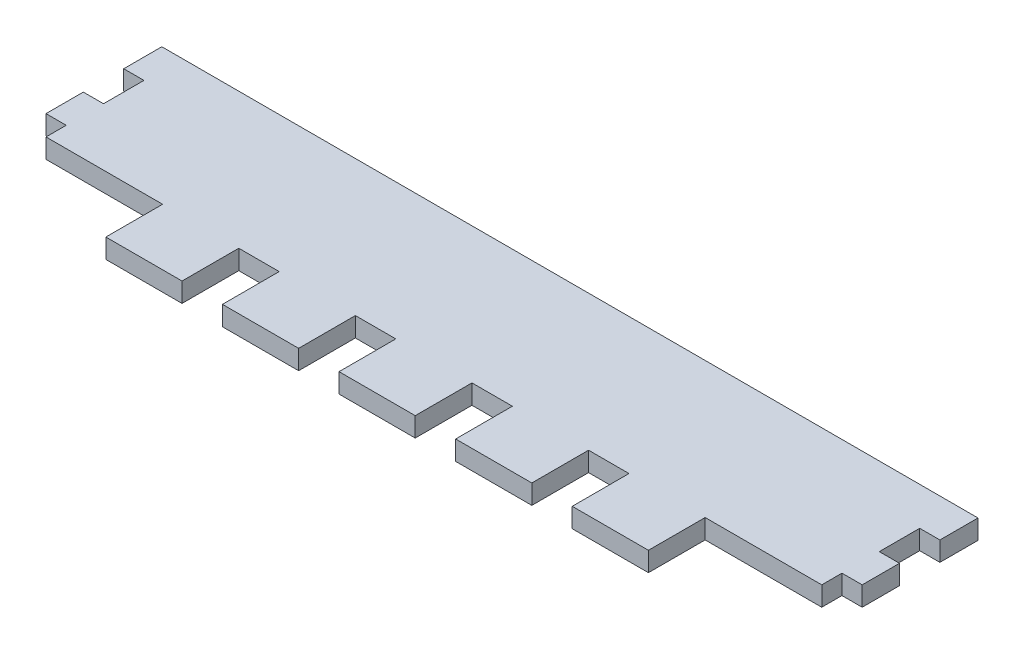
ISO-10303-21;
HEADER;
FILE_DESCRIPTION(('STEP AP214'),'2;1');
FILE_NAME('part.step','',(''),(''),'','','');
FILE_SCHEMA(('AUTOMOTIVE_DESIGN { 1 0 10303 214 1 1 1 1 }'));
ENDSEC;
DATA;
#1=APPLICATION_CONTEXT('core data for automotive mechanical design processes');
#2=APPLICATION_PROTOCOL_DEFINITION('international standard','automotive_design',2000,#1);
#3=PRODUCT_CONTEXT('',#1,'mechanical');
#4=PRODUCT('Part','Part','',(#3));
#5=PRODUCT_RELATED_PRODUCT_CATEGORY('part','',(#4));
#6=PRODUCT_DEFINITION_FORMATION('','',#4);
#7=PRODUCT_DEFINITION_CONTEXT('part definition',#1,'design');
#8=PRODUCT_DEFINITION('design','',#6,#7);
#9=PRODUCT_DEFINITION_SHAPE('','',#8);
#10=(LENGTH_UNIT() NAMED_UNIT(*) SI_UNIT(.MILLI.,.METRE.));
#11=(NAMED_UNIT(*) PLANE_ANGLE_UNIT() SI_UNIT($,.RADIAN.));
#12=(NAMED_UNIT(*) SI_UNIT($,.STERADIAN.) SOLID_ANGLE_UNIT());
#13=UNCERTAINTY_MEASURE_WITH_UNIT(LENGTH_MEASURE(1.E-05),#10,'distance_accuracy_value','');
#14=(GEOMETRIC_REPRESENTATION_CONTEXT(3) GLOBAL_UNCERTAINTY_ASSIGNED_CONTEXT((#13)) GLOBAL_UNIT_ASSIGNED_CONTEXT((#10,
#11,#12)) REPRESENTATION_CONTEXT('',''));
#15=CARTESIAN_POINT('',(0.,0.,0.));
#16=DIRECTION('',(0.,0.,1.));
#17=DIRECTION('',(1.,0.,0.));
#18=AXIS2_PLACEMENT_3D('',#15,#16,#17);
#19=CARTESIAN_POINT('',(-133.35,6.35,28.575));
#20=DIRECTION('',(0.,0.,-1.));
#21=DIRECTION('',(-1.,0.,0.));
#22=AXIS2_PLACEMENT_3D('',#19,#20,#21);
#23=PLANE('',#22);
#24=DIRECTION('',(0.,-1.,0.));
#25=VECTOR('',#24,1.);
#26=CARTESIAN_POINT('',(126.746000000001,6.35,28.575));
#27=LINE('',#26,#25);
#28=CARTESIAN_POINT('',(126.746000000001,6.35,28.575));
#29=VERTEX_POINT('',#28);
#30=CARTESIAN_POINT('',(126.746000000001,0.,28.575));
#31=VERTEX_POINT('',#30);
#32=EDGE_CURVE('E391',#29,#31,#27,.T.);
#33=ORIENTED_EDGE('',*,*,#32,.F.);
#34=DIRECTION('',(1.,0.,0.));
#35=VECTOR('',#34,1.);
#36=CARTESIAN_POINT('',(-133.35,6.35,28.575));
#37=LINE('',#36,#35);
#38=CARTESIAN_POINT('',(88.646,6.35,28.575));
#39=VERTEX_POINT('',#38);
#40=EDGE_CURVE('E625',#39,#29,#37,.T.);
#41=ORIENTED_EDGE('',*,*,#40,.F.);
#42=DIRECTION('',(0.,-1.,0.));
#43=VECTOR('',#42,1.);
#44=CARTESIAN_POINT('',(88.646,6.35,28.575));
#45=LINE('',#44,#43);
#46=CARTESIAN_POINT('',(88.646,0.,28.575));
#47=VERTEX_POINT('',#46);
#48=EDGE_CURVE('E426',#39,#47,#45,.T.);
#49=ORIENTED_EDGE('',*,*,#48,.T.);
#50=DIRECTION('',(1.,0.,0.));
#51=VECTOR('',#50,1.);
#52=CARTESIAN_POINT('',(-133.35,0.,28.575));
#53=LINE('',#52,#51);
#54=EDGE_CURVE('E591',#47,#31,#53,.T.);
#55=ORIENTED_EDGE('',*,*,#54,.T.);
#56=EDGE_LOOP('',(#33,#41,#49,#55));
#57=FACE_BOUND('',#56,.T.);
#58=ADVANCED_FACE('F38',(#57),#23,.F.);
#59=DIRECTION('',(0.,1.,0.));
#60=VECTOR('',#59,1.);
#61=CARTESIAN_POINT('',(-126.745999999999,6.35,28.575));
#62=LINE('',#61,#60);
#63=CARTESIAN_POINT('',(-126.745999999999,0.,28.575));
#64=VERTEX_POINT('',#63);
#65=CARTESIAN_POINT('',(-126.745999999999,6.35,28.575));
#66=VERTEX_POINT('',#65);
#67=EDGE_CURVE('E400',#64,#66,#62,.T.);
#68=ORIENTED_EDGE('',*,*,#67,.F.);
#69=CARTESIAN_POINT('',(-88.646,0.,28.575));
#70=VERTEX_POINT('',#69);
#71=EDGE_CURVE('E587',#64,#70,#53,.T.);
#72=ORIENTED_EDGE('',*,*,#71,.T.);
#73=DIRECTION('',(0.,-1.,0.));
#74=VECTOR('',#73,1.);
#75=CARTESIAN_POINT('',(-88.646,6.35,28.575));
#76=LINE('',#75,#74);
#77=CARTESIAN_POINT('',(-88.646,6.35,28.575));
#78=VERTEX_POINT('',#77);
#79=EDGE_CURVE('E282',#78,#70,#76,.T.);
#80=ORIENTED_EDGE('',*,*,#79,.F.);
#81=EDGE_CURVE('E328',#66,#78,#37,.T.);
#82=ORIENTED_EDGE('',*,*,#81,.F.);
#83=EDGE_LOOP('',(#68,#72,#80,#82));
#84=FACE_BOUND('',#83,.T.);
#85=ADVANCED_FACE('F585',(#84),#23,.F.);
#86=CARTESIAN_POINT('',(133.35,6.35,28.575));
#87=DIRECTION('',(-1.,0.,0.));
#88=DIRECTION('',(0.,0.,1.));
#89=AXIS2_PLACEMENT_3D('',#86,#87,#88);
#90=PLANE('',#89);
#91=DIRECTION('',(0.,1.,0.));
#92=VECTOR('',#91,1.);
#93=CARTESIAN_POINT('',(133.35,6.35,-3.42900000000001));
#94=LINE('',#93,#92);
#95=CARTESIAN_POINT('',(133.35,0.,-3.429));
#96=VERTEX_POINT('',#95);
#97=CARTESIAN_POINT('',(133.35,6.35,-3.429));
#98=VERTEX_POINT('',#97);
#99=EDGE_CURVE('E279',#96,#98,#94,.T.);
#100=ORIENTED_EDGE('',*,*,#99,.F.);
#101=DIRECTION('',(0.,0.,-1.));
#102=VECTOR('',#101,1.);
#103=CARTESIAN_POINT('',(133.35,0.,28.575));
#104=LINE('',#103,#102);
#105=CARTESIAN_POINT('',(133.35,0.,-15.875));
#106=VERTEX_POINT('',#105);
#107=EDGE_CURVE('E274',#96,#106,#104,.T.);
#108=ORIENTED_EDGE('',*,*,#107,.T.);
#109=DIRECTION('',(0.,1.,0.));
#110=VECTOR('',#109,1.);
#111=CARTESIAN_POINT('',(133.35,0.,-15.875));
#112=LINE('',#111,#110);
#113=CARTESIAN_POINT('',(133.35,6.35,-15.875));
#114=VERTEX_POINT('',#113);
#115=EDGE_CURVE('E278',#106,#114,#112,.T.);
#116=ORIENTED_EDGE('',*,*,#115,.T.);
#117=DIRECTION('',(0.,0.,-1.));
#118=VECTOR('',#117,1.);
#119=CARTESIAN_POINT('',(133.35,6.35,28.575));
#120=LINE('',#119,#118);
#121=EDGE_CURVE('E325',#98,#114,#120,.T.);
#122=ORIENTED_EDGE('',*,*,#121,.F.);
#123=EDGE_LOOP('',(#100,#108,#116,#122));
#124=FACE_BOUND('',#123,.T.);
#125=ADVANCED_FACE('F40',(#124),#90,.F.);
#126=DIRECTION('',(0.,-1.,0.));
#127=VECTOR('',#126,1.);
#128=CARTESIAN_POINT('',(133.35,6.35,9.779));
#129=LINE('',#128,#127);
#130=CARTESIAN_POINT('',(133.35,6.35,9.779));
#131=VERTEX_POINT('',#130);
#132=CARTESIAN_POINT('',(133.35,0.,9.779));
#133=VERTEX_POINT('',#132);
#134=EDGE_CURVE('E402',#131,#133,#129,.T.);
#135=ORIENTED_EDGE('',*,*,#134,.F.);
#136=CARTESIAN_POINT('',(133.35,6.35,21.971));
#137=VERTEX_POINT('',#136);
#138=EDGE_CURVE('E324',#137,#131,#120,.T.);
#139=ORIENTED_EDGE('',*,*,#138,.F.);
#140=DIRECTION('',(0.,1.,0.));
#141=VECTOR('',#140,1.);
#142=CARTESIAN_POINT('',(133.35,6.35,21.971));
#143=LINE('',#142,#141);
#144=CARTESIAN_POINT('',(133.35,0.,21.971));
#145=VERTEX_POINT('',#144);
#146=EDGE_CURVE('E393',#145,#137,#143,.T.);
#147=ORIENTED_EDGE('',*,*,#146,.F.);
#148=EDGE_CURVE('E281',#145,#133,#104,.T.);
#149=ORIENTED_EDGE('',*,*,#148,.T.);
#150=EDGE_LOOP('',(#135,#139,#147,#149));
#151=FACE_BOUND('',#150,.T.);
#152=ADVANCED_FACE('F655',(#151),#90,.F.);
#153=CARTESIAN_POINT('',(-133.35,6.35,28.575));
#154=DIRECTION('',(1.,0.,0.));
#155=DIRECTION('',(0.,0.,-1.));
#156=AXIS2_PLACEMENT_3D('',#153,#154,#155);
#157=PLANE('',#156);
#158=DIRECTION('',(0.,-1.,0.));
#159=VECTOR('',#158,1.);
#160=CARTESIAN_POINT('',(-133.35,6.35,21.9710000000019));
#161=LINE('',#160,#159);
#162=CARTESIAN_POINT('',(-133.35,6.35,21.9710000000019));
#163=VERTEX_POINT('',#162);
#164=CARTESIAN_POINT('',(-133.35,0.,21.9710000000019));
#165=VERTEX_POINT('',#164);
#166=EDGE_CURVE('E61',#163,#165,#161,.T.);
#167=ORIENTED_EDGE('',*,*,#166,.F.);
#168=DIRECTION('',(0.,0.,1.));
#169=VECTOR('',#168,1.);
#170=CARTESIAN_POINT('',(-133.35,6.35,28.575));
#171=LINE('',#170,#169);
#172=CARTESIAN_POINT('',(-133.35,6.35,9.77900000000186));
#173=VERTEX_POINT('',#172);
#174=EDGE_CURVE('E318',#173,#163,#171,.T.);
#175=ORIENTED_EDGE('',*,*,#174,.F.);
#176=DIRECTION('',(0.,1.,0.));
#177=VECTOR('',#176,1.);
#178=CARTESIAN_POINT('',(-133.35,6.35,9.77900000000186));
#179=LINE('',#178,#177);
#180=CARTESIAN_POINT('',(-133.35,0.,9.77900000000186));
#181=VERTEX_POINT('',#180);
#182=EDGE_CURVE('E395',#181,#173,#179,.T.);
#183=ORIENTED_EDGE('',*,*,#182,.F.);
#184=DIRECTION('',(0.,0.,1.));
#185=VECTOR('',#184,1.);
#186=CARTESIAN_POINT('',(-133.35,0.,28.575));
#187=LINE('',#186,#185);
#188=EDGE_CURVE('E656',#181,#165,#187,.T.);
#189=ORIENTED_EDGE('',*,*,#188,.T.);
#190=EDGE_LOOP('',(#167,#175,#183,#189));
#191=FACE_BOUND('',#190,.T.);
#192=ADVANCED_FACE('F676',(#191),#157,.F.);
#193=DIRECTION('',(0.,-1.,0.));
#194=VECTOR('',#193,1.);
#195=CARTESIAN_POINT('',(-133.35,6.35,-3.42899999999814));
#196=LINE('',#195,#194);
#197=CARTESIAN_POINT('',(-133.35,6.35,-3.42899999999814));
#198=VERTEX_POINT('',#197);
#199=CARTESIAN_POINT('',(-133.35,0.,-3.42899999999814));
#200=VERTEX_POINT('',#199);
#201=EDGE_CURVE('E397',#198,#200,#196,.T.);
#202=ORIENTED_EDGE('',*,*,#201,.F.);
#203=CARTESIAN_POINT('',(-133.35,6.35,-15.875));
#204=VERTEX_POINT('',#203);
#205=EDGE_CURVE('E323',#204,#198,#171,.T.);
#206=ORIENTED_EDGE('',*,*,#205,.F.);
#207=DIRECTION('',(0.,1.,0.));
#208=VECTOR('',#207,1.);
#209=CARTESIAN_POINT('',(-133.35,0.,-15.875));
#210=LINE('',#209,#208);
#211=CARTESIAN_POINT('',(-133.35,0.,-15.875));
#212=VERTEX_POINT('',#211);
#213=EDGE_CURVE('E299',#212,#204,#210,.T.);
#214=ORIENTED_EDGE('',*,*,#213,.F.);
#215=EDGE_CURVE('E289',#212,#200,#187,.T.);
#216=ORIENTED_EDGE('',*,*,#215,.T.);
#217=EDGE_LOOP('',(#202,#206,#214,#216));
#218=FACE_BOUND('',#217,.T.);
#219=ADVANCED_FACE('F686',(#218),#157,.F.);
#220=CARTESIAN_POINT('',(0.,6.35,0.));
#221=DIRECTION('',(0.,-1.,0.));
#222=DIRECTION('',(0.,0.,-1.));
#223=AXIS2_PLACEMENT_3D('',#220,#221,#222);
#224=PLANE('',#223);
#225=DIRECTION('',(0.,0.,1.));
#226=VECTOR('',#225,1.);
#227=CARTESIAN_POINT('',(126.746,6.35,-3.429));
#228=LINE('',#227,#226);
#229=CARTESIAN_POINT('',(126.746,6.35,-3.429));
#230=VERTEX_POINT('',#229);
#231=CARTESIAN_POINT('',(126.746,6.35,9.779));
#232=VERTEX_POINT('',#231);
#233=EDGE_CURVE('E356',#230,#232,#228,.T.);
#234=ORIENTED_EDGE('',*,*,#233,.F.);
#235=DIRECTION('',(-1.,0.,0.));
#236=VECTOR('',#235,1.);
#237=CARTESIAN_POINT('',(126.746,6.35,-3.429));
#238=LINE('',#237,#236);
#239=EDGE_CURVE('E352',#98,#230,#238,.T.);
#240=ORIENTED_EDGE('',*,*,#239,.F.);
#241=ORIENTED_EDGE('',*,*,#121,.T.);
#242=DIRECTION('',(1.,0.,0.));
#243=VECTOR('',#242,1.);
#244=CARTESIAN_POINT('',(-139.768815304629,6.35,-15.875));
#245=LINE('',#244,#243);
#246=EDGE_CURVE('E294',#204,#114,#245,.T.);
#247=ORIENTED_EDGE('',*,*,#246,.F.);
#248=ORIENTED_EDGE('',*,*,#205,.T.);
#249=DIRECTION('',(-1.,0.,0.));
#250=VECTOR('',#249,1.);
#251=CARTESIAN_POINT('',(-139.954,6.35,-3.42899999999814));
#252=LINE('',#251,#250);
#253=CARTESIAN_POINT('',(-126.746,6.35,-3.42899999999814));
#254=VERTEX_POINT('',#253);
#255=EDGE_CURVE('E377',#254,#198,#252,.T.);
#256=ORIENTED_EDGE('',*,*,#255,.F.);
#257=DIRECTION('',(0.,0.,-1.));
#258=VECTOR('',#257,1.);
#259=CARTESIAN_POINT('',(-126.746,6.35,-3.42899999999814));
#260=LINE('',#259,#258);
#261=CARTESIAN_POINT('',(-126.746,6.35,9.77900000000186));
#262=VERTEX_POINT('',#261);
#263=EDGE_CURVE('E374',#262,#254,#260,.T.);
#264=ORIENTED_EDGE('',*,*,#263,.F.);
#265=DIRECTION('',(1.,0.,0.));
#266=VECTOR('',#265,1.);
#267=CARTESIAN_POINT('',(-139.954,6.35,9.77900000000186));
#268=LINE('',#267,#266);
#269=EDGE_CURVE('E381',#173,#262,#268,.T.);
#270=ORIENTED_EDGE('',*,*,#269,.F.);
#271=ORIENTED_EDGE('',*,*,#174,.T.);
#272=DIRECTION('',(-1.,0.,0.));
#273=VECTOR('',#272,1.);
#274=CARTESIAN_POINT('',(-139.953999999999,6.35,21.9710000000019));
#275=LINE('',#274,#273);
#276=CARTESIAN_POINT('',(-126.745999999999,6.35,21.9710000000019));
#277=VERTEX_POINT('',#276);
#278=EDGE_CURVE('E339',#277,#163,#275,.T.);
#279=ORIENTED_EDGE('',*,*,#278,.F.);
#280=DIRECTION('',(0.,0.,-1.));
#281=VECTOR('',#280,1.);
#282=CARTESIAN_POINT('',(-126.745999999999,6.35,21.9710000000019));
#283=LINE('',#282,#281);
#284=EDGE_CURVE('E344',#66,#277,#283,.T.);
#285=ORIENTED_EDGE('',*,*,#284,.F.);
#286=ORIENTED_EDGE('',*,*,#81,.T.);
#287=DIRECTION('',(0.,0.,1.));
#288=VECTOR('',#287,1.);
#289=CARTESIAN_POINT('',(-88.646,6.35,28.575));
#290=LINE('',#289,#288);
#291=CARTESIAN_POINT('',(-88.646,6.35,47.117));
#292=VERTEX_POINT('',#291);
#293=EDGE_CURVE('E549',#78,#292,#290,.T.);
#294=ORIENTED_EDGE('',*,*,#293,.T.);
#295=DIRECTION('',(1.,0.,0.));
#296=VECTOR('',#295,1.);
#297=CARTESIAN_POINT('',(-88.646,6.35,47.117));
#298=LINE('',#297,#296);
#299=CARTESIAN_POINT('',(-63.754,6.35,47.117));
#300=VERTEX_POINT('',#299);
#301=EDGE_CURVE('E553',#292,#300,#298,.T.);
#302=ORIENTED_EDGE('',*,*,#301,.T.);
#303=DIRECTION('',(0.,0.,-1.));
#304=VECTOR('',#303,1.);
#305=CARTESIAN_POINT('',(-63.754,6.35,47.117));
#306=LINE('',#305,#304);
#307=CARTESIAN_POINT('',(-63.754,6.35,28.575));
#308=VERTEX_POINT('',#307);
#309=EDGE_CURVE('E559',#300,#308,#306,.T.);
#310=ORIENTED_EDGE('',*,*,#309,.T.);
#311=CARTESIAN_POINT('',(-50.546,6.35,28.575));
#312=VERTEX_POINT('',#311);
#313=EDGE_CURVE('E608',#308,#312,#37,.T.);
#314=ORIENTED_EDGE('',*,*,#313,.T.);
#315=DIRECTION('',(0.,0.,1.));
#316=VECTOR('',#315,1.);
#317=CARTESIAN_POINT('',(-50.546,6.35,28.575));
#318=LINE('',#317,#316);
#319=CARTESIAN_POINT('',(-50.546,6.35,47.117));
#320=VERTEX_POINT('',#319);
#321=EDGE_CURVE('E514',#312,#320,#318,.T.);
#322=ORIENTED_EDGE('',*,*,#321,.T.);
#323=DIRECTION('',(1.,0.,0.));
#324=VECTOR('',#323,1.);
#325=CARTESIAN_POINT('',(-50.546,6.35,47.117));
#326=LINE('',#325,#324);
#327=CARTESIAN_POINT('',(-25.654,6.35,47.117));
#328=VERTEX_POINT('',#327);
#329=EDGE_CURVE('E518',#320,#328,#326,.T.);
#330=ORIENTED_EDGE('',*,*,#329,.T.);
#331=DIRECTION('',(0.,0.,-1.));
#332=VECTOR('',#331,1.);
#333=CARTESIAN_POINT('',(-25.654,6.35,47.117));
#334=LINE('',#333,#332);
#335=CARTESIAN_POINT('',(-25.654,6.35,28.575));
#336=VERTEX_POINT('',#335);
#337=EDGE_CURVE('E526',#328,#336,#334,.T.);
#338=ORIENTED_EDGE('',*,*,#337,.T.);
#339=CARTESIAN_POINT('',(-12.446,6.35,28.575));
#340=VERTEX_POINT('',#339);
#341=EDGE_CURVE('E613',#336,#340,#37,.T.);
#342=ORIENTED_EDGE('',*,*,#341,.T.);
#343=DIRECTION('',(0.,0.,1.));
#344=VECTOR('',#343,1.);
#345=CARTESIAN_POINT('',(-12.446,6.35,28.575));
#346=LINE('',#345,#344);
#347=CARTESIAN_POINT('',(-12.446,6.35,47.117));
#348=VERTEX_POINT('',#347);
#349=EDGE_CURVE('E479',#340,#348,#346,.T.);
#350=ORIENTED_EDGE('',*,*,#349,.T.);
#351=DIRECTION('',(1.,0.,0.));
#352=VECTOR('',#351,1.);
#353=CARTESIAN_POINT('',(-12.446,6.35,47.117));
#354=LINE('',#353,#352);
#355=CARTESIAN_POINT('',(12.446,6.35,47.117));
#356=VERTEX_POINT('',#355);
#357=EDGE_CURVE('E483',#348,#356,#354,.T.);
#358=ORIENTED_EDGE('',*,*,#357,.T.);
#359=DIRECTION('',(0.,0.,-1.));
#360=VECTOR('',#359,1.);
#361=CARTESIAN_POINT('',(12.446,6.35,47.117));
#362=LINE('',#361,#360);
#363=CARTESIAN_POINT('',(12.446,6.35,28.575));
#364=VERTEX_POINT('',#363);
#365=EDGE_CURVE('E491',#356,#364,#362,.T.);
#366=ORIENTED_EDGE('',*,*,#365,.T.);
#367=CARTESIAN_POINT('',(25.654,6.35,28.575));
#368=VERTEX_POINT('',#367);
#369=EDGE_CURVE('E617',#364,#368,#37,.T.);
#370=ORIENTED_EDGE('',*,*,#369,.T.);
#371=DIRECTION('',(0.,0.,1.));
#372=VECTOR('',#371,1.);
#373=CARTESIAN_POINT('',(25.654,6.35,28.575));
#374=LINE('',#373,#372);
#375=CARTESIAN_POINT('',(25.654,6.35,47.117));
#376=VERTEX_POINT('',#375);
#377=EDGE_CURVE('E444',#368,#376,#374,.T.);
#378=ORIENTED_EDGE('',*,*,#377,.T.);
#379=DIRECTION('',(1.,0.,0.));
#380=VECTOR('',#379,1.);
#381=CARTESIAN_POINT('',(25.654,6.35,47.117));
#382=LINE('',#381,#380);
#383=CARTESIAN_POINT('',(50.546,6.35,47.117));
#384=VERTEX_POINT('',#383);
#385=EDGE_CURVE('E448',#376,#384,#382,.T.);
#386=ORIENTED_EDGE('',*,*,#385,.T.);
#387=DIRECTION('',(0.,0.,-1.));
#388=VECTOR('',#387,1.);
#389=CARTESIAN_POINT('',(50.546,6.35,47.117));
#390=LINE('',#389,#388);
#391=CARTESIAN_POINT('',(50.546,6.35,28.575));
#392=VERTEX_POINT('',#391);
#393=EDGE_CURVE('E456',#384,#392,#390,.T.);
#394=ORIENTED_EDGE('',*,*,#393,.T.);
#395=CARTESIAN_POINT('',(63.754,6.35,28.575));
#396=VERTEX_POINT('',#395);
#397=EDGE_CURVE('E621',#392,#396,#37,.T.);
#398=ORIENTED_EDGE('',*,*,#397,.T.);
#399=DIRECTION('',(0.,0.,1.));
#400=VECTOR('',#399,1.);
#401=CARTESIAN_POINT('',(63.754,6.35,28.575));
#402=LINE('',#401,#400);
#403=CARTESIAN_POINT('',(63.754,6.35,47.117));
#404=VERTEX_POINT('',#403);
#405=EDGE_CURVE('E406',#396,#404,#402,.T.);
#406=ORIENTED_EDGE('',*,*,#405,.T.);
#407=DIRECTION('',(1.,0.,0.));
#408=VECTOR('',#407,1.);
#409=CARTESIAN_POINT('',(63.754,6.35,47.117));
#410=LINE('',#409,#408);
#411=CARTESIAN_POINT('',(88.646,6.35,47.117));
#412=VERTEX_POINT('',#411);
#413=EDGE_CURVE('E410',#404,#412,#410,.T.);
#414=ORIENTED_EDGE('',*,*,#413,.T.);
#415=DIRECTION('',(0.,0.,-1.));
#416=VECTOR('',#415,1.);
#417=CARTESIAN_POINT('',(88.646,6.35,47.117));
#418=LINE('',#417,#416);
#419=EDGE_CURVE('E421',#412,#39,#418,.T.);
#420=ORIENTED_EDGE('',*,*,#419,.T.);
#421=ORIENTED_EDGE('',*,*,#40,.T.);
#422=DIRECTION('',(0.,0.,1.));
#423=VECTOR('',#422,1.);
#424=CARTESIAN_POINT('',(126.746000000001,6.35,21.971));
#425=LINE('',#424,#423);
#426=CARTESIAN_POINT('',(126.746000000001,6.35,21.971));
#427=VERTEX_POINT('',#426);
#428=EDGE_CURVE('E630',#427,#29,#425,.T.);
#429=ORIENTED_EDGE('',*,*,#428,.F.);
#430=DIRECTION('',(-1.,0.,0.));
#431=VECTOR('',#430,1.);
#432=CARTESIAN_POINT('',(126.746000000001,6.35,21.971));
#433=LINE('',#432,#431);
#434=EDGE_CURVE('E306',#137,#427,#433,.T.);
#435=ORIENTED_EDGE('',*,*,#434,.F.);
#436=ORIENTED_EDGE('',*,*,#138,.T.);
#437=DIRECTION('',(1.,0.,0.));
#438=VECTOR('',#437,1.);
#439=CARTESIAN_POINT('',(126.746,6.35,9.779));
#440=LINE('',#439,#438);
#441=EDGE_CURVE('E361',#232,#131,#440,.T.);
#442=ORIENTED_EDGE('',*,*,#441,.F.);
#443=EDGE_LOOP('',(#234,#240,#241,#247,#248,#256,#264,#270,#271,#279,#285,#286,#294,#302,#310,
#314,#322,#330,#338,#342,#350,#358,#366,#370,#378,#386,#394,#398,#406,#414,#420,#421,#429,#435,
#436,#442));
#444=FACE_BOUND('',#443,.T.);
#445=ADVANCED_FACE('F607',(#444),#224,.F.);
#446=CARTESIAN_POINT('',(0.,0.,0.));
#447=DIRECTION('',(0.,-1.,0.));
#448=DIRECTION('',(0.,0.,-1.));
#449=AXIS2_PLACEMENT_3D('',#446,#447,#448);
#450=PLANE('',#449);
#451=DIRECTION('',(0.,0.,-1.));
#452=VECTOR('',#451,1.);
#453=CARTESIAN_POINT('',(-126.746,0.,-3.42899999999814));
#454=LINE('',#453,#452);
#455=CARTESIAN_POINT('',(-126.746,0.,9.77900000000186));
#456=VERTEX_POINT('',#455);
#457=CARTESIAN_POINT('',(-126.746,0.,-3.42899999999814));
#458=VERTEX_POINT('',#457);
#459=EDGE_CURVE('E53',#456,#458,#454,.T.);
#460=ORIENTED_EDGE('',*,*,#459,.T.);
#461=DIRECTION('',(-1.,0.,0.));
#462=VECTOR('',#461,1.);
#463=CARTESIAN_POINT('',(-139.954,0.,-3.42899999999814));
#464=LINE('',#463,#462);
#465=EDGE_CURVE('E378',#458,#200,#464,.T.);
#466=ORIENTED_EDGE('',*,*,#465,.T.);
#467=ORIENTED_EDGE('',*,*,#215,.F.);
#468=DIRECTION('',(1.,0.,0.));
#469=VECTOR('',#468,1.);
#470=CARTESIAN_POINT('',(-139.768815304629,0.,-15.875));
#471=LINE('',#470,#469);
#472=EDGE_CURVE('E285',#212,#106,#471,.T.);
#473=ORIENTED_EDGE('',*,*,#472,.T.);
#474=ORIENTED_EDGE('',*,*,#107,.F.);
#475=DIRECTION('',(-1.,0.,0.));
#476=VECTOR('',#475,1.);
#477=CARTESIAN_POINT('',(0.,0.,-3.429));
#478=LINE('',#477,#476);
#479=CARTESIAN_POINT('',(126.746,0.,-3.429));
#480=VERTEX_POINT('',#479);
#481=EDGE_CURVE('E12',#96,#480,#478,.T.);
#482=ORIENTED_EDGE('',*,*,#481,.T.);
#483=DIRECTION('',(0.,0.,1.));
#484=VECTOR('',#483,1.);
#485=CARTESIAN_POINT('',(126.746,0.,-3.429));
#486=LINE('',#485,#484);
#487=CARTESIAN_POINT('',(126.746,0.,9.779));
#488=VERTEX_POINT('',#487);
#489=EDGE_CURVE('E366',#480,#488,#486,.T.);
#490=ORIENTED_EDGE('',*,*,#489,.T.);
#491=DIRECTION('',(1.,0.,0.));
#492=VECTOR('',#491,1.);
#493=CARTESIAN_POINT('',(126.746,0.,9.779));
#494=LINE('',#493,#492);
#495=EDGE_CURVE('E357',#488,#133,#494,.T.);
#496=ORIENTED_EDGE('',*,*,#495,.T.);
#497=ORIENTED_EDGE('',*,*,#148,.F.);
#498=DIRECTION('',(-1.,0.,0.));
#499=VECTOR('',#498,1.);
#500=CARTESIAN_POINT('',(0.,0.,21.971));
#501=LINE('',#500,#499);
#502=CARTESIAN_POINT('',(126.746000000001,0.,21.971));
#503=VERTEX_POINT('',#502);
#504=EDGE_CURVE('E660',#145,#503,#501,.T.);
#505=ORIENTED_EDGE('',*,*,#504,.T.);
#506=DIRECTION('',(0.,0.,1.));
#507=VECTOR('',#506,1.);
#508=CARTESIAN_POINT('',(126.746000000001,0.,21.971));
#509=LINE('',#508,#507);
#510=EDGE_CURVE('E293',#503,#31,#509,.T.);
#511=ORIENTED_EDGE('',*,*,#510,.T.);
#512=ORIENTED_EDGE('',*,*,#54,.F.);
#513=DIRECTION('',(0.,0.,-1.));
#514=VECTOR('',#513,1.);
#515=CARTESIAN_POINT('',(88.646,0.,47.117));
#516=LINE('',#515,#514);
#517=CARTESIAN_POINT('',(88.646,0.,47.117));
#518=VERTEX_POINT('',#517);
#519=EDGE_CURVE('E411',#518,#47,#516,.T.);
#520=ORIENTED_EDGE('',*,*,#519,.F.);
#521=DIRECTION('',(1.,0.,0.));
#522=VECTOR('',#521,1.);
#523=CARTESIAN_POINT('',(63.754,0.,47.117));
#524=LINE('',#523,#522);
#525=CARTESIAN_POINT('',(63.754,0.,47.117));
#526=VERTEX_POINT('',#525);
#527=EDGE_CURVE('E428',#526,#518,#524,.T.);
#528=ORIENTED_EDGE('',*,*,#527,.F.);
#529=DIRECTION('',(0.,0.,1.));
#530=VECTOR('',#529,1.);
#531=CARTESIAN_POINT('',(63.754,0.,28.575));
#532=LINE('',#531,#530);
#533=CARTESIAN_POINT('',(63.754,0.,28.575));
#534=VERTEX_POINT('',#533);
#535=EDGE_CURVE('E405',#534,#526,#532,.T.);
#536=ORIENTED_EDGE('',*,*,#535,.F.);
#537=CARTESIAN_POINT('',(50.546,0.,28.575));
#538=VERTEX_POINT('',#537);
#539=EDGE_CURVE('E688',#538,#534,#53,.T.);
#540=ORIENTED_EDGE('',*,*,#539,.F.);
#541=DIRECTION('',(0.,0.,-1.));
#542=VECTOR('',#541,1.);
#543=CARTESIAN_POINT('',(50.546,0.,47.117));
#544=LINE('',#543,#542);
#545=CARTESIAN_POINT('',(50.546,0.,47.117));
#546=VERTEX_POINT('',#545);
#547=EDGE_CURVE('E449',#546,#538,#544,.T.);
#548=ORIENTED_EDGE('',*,*,#547,.F.);
#549=DIRECTION('',(1.,0.,0.));
#550=VECTOR('',#549,1.);
#551=CARTESIAN_POINT('',(25.654,0.,47.117));
#552=LINE('',#551,#550);
#553=CARTESIAN_POINT('',(25.654,0.,47.117));
#554=VERTEX_POINT('',#553);
#555=EDGE_CURVE('E463',#554,#546,#552,.T.);
#556=ORIENTED_EDGE('',*,*,#555,.F.);
#557=DIRECTION('',(0.,0.,1.));
#558=VECTOR('',#557,1.);
#559=CARTESIAN_POINT('',(25.654,0.,28.575));
#560=LINE('',#559,#558);
#561=CARTESIAN_POINT('',(25.654,0.,28.575));
#562=VERTEX_POINT('',#561);
#563=EDGE_CURVE('E443',#562,#554,#560,.T.);
#564=ORIENTED_EDGE('',*,*,#563,.F.);
#565=CARTESIAN_POINT('',(12.446,0.,28.575));
#566=VERTEX_POINT('',#565);
#567=EDGE_CURVE('E691',#566,#562,#53,.T.);
#568=ORIENTED_EDGE('',*,*,#567,.F.);
#569=DIRECTION('',(0.,0.,-1.));
#570=VECTOR('',#569,1.);
#571=CARTESIAN_POINT('',(12.446,0.,47.117));
#572=LINE('',#571,#570);
#573=CARTESIAN_POINT('',(12.446,0.,47.117));
#574=VERTEX_POINT('',#573);
#575=EDGE_CURVE('E484',#574,#566,#572,.T.);
#576=ORIENTED_EDGE('',*,*,#575,.F.);
#577=DIRECTION('',(1.,0.,0.));
#578=VECTOR('',#577,1.);
#579=CARTESIAN_POINT('',(-12.446,0.,47.117));
#580=LINE('',#579,#578);
#581=CARTESIAN_POINT('',(-12.446,0.,47.117));
#582=VERTEX_POINT('',#581);
#583=EDGE_CURVE('E498',#582,#574,#580,.T.);
#584=ORIENTED_EDGE('',*,*,#583,.F.);
#585=DIRECTION('',(0.,0.,1.));
#586=VECTOR('',#585,1.);
#587=CARTESIAN_POINT('',(-12.446,0.,28.575));
#588=LINE('',#587,#586);
#589=CARTESIAN_POINT('',(-12.446,0.,28.575));
#590=VERTEX_POINT('',#589);
#591=EDGE_CURVE('E478',#590,#582,#588,.T.);
#592=ORIENTED_EDGE('',*,*,#591,.F.);
#593=CARTESIAN_POINT('',(-25.654,0.,28.575));
#594=VERTEX_POINT('',#593);
#595=EDGE_CURVE('E694',#594,#590,#53,.T.);
#596=ORIENTED_EDGE('',*,*,#595,.F.);
#597=DIRECTION('',(0.,0.,-1.));
#598=VECTOR('',#597,1.);
#599=CARTESIAN_POINT('',(-25.654,0.,47.117));
#600=LINE('',#599,#598);
#601=CARTESIAN_POINT('',(-25.654,0.,47.117));
#602=VERTEX_POINT('',#601);
#603=EDGE_CURVE('E519',#602,#594,#600,.T.);
#604=ORIENTED_EDGE('',*,*,#603,.F.);
#605=DIRECTION('',(1.,0.,0.));
#606=VECTOR('',#605,1.);
#607=CARTESIAN_POINT('',(-50.546,0.,47.117));
#608=LINE('',#607,#606);
#609=CARTESIAN_POINT('',(-50.546,0.,47.117));
#610=VERTEX_POINT('',#609);
#611=EDGE_CURVE('E533',#610,#602,#608,.T.);
#612=ORIENTED_EDGE('',*,*,#611,.F.);
#613=DIRECTION('',(0.,0.,1.));
#614=VECTOR('',#613,1.);
#615=CARTESIAN_POINT('',(-50.546,0.,28.575));
#616=LINE('',#615,#614);
#617=CARTESIAN_POINT('',(-50.546,0.,28.575));
#618=VERTEX_POINT('',#617);
#619=EDGE_CURVE('E513',#618,#610,#616,.T.);
#620=ORIENTED_EDGE('',*,*,#619,.F.);
#621=CARTESIAN_POINT('',(-63.754,0.,28.575));
#622=VERTEX_POINT('',#621);
#623=EDGE_CURVE('E589',#622,#618,#53,.T.);
#624=ORIENTED_EDGE('',*,*,#623,.F.);
#625=DIRECTION('',(0.,0.,-1.));
#626=VECTOR('',#625,1.);
#627=CARTESIAN_POINT('',(-63.754,0.,47.117));
#628=LINE('',#627,#626);
#629=CARTESIAN_POINT('',(-63.754,0.,47.117));
#630=VERTEX_POINT('',#629);
#631=EDGE_CURVE('E554',#630,#622,#628,.T.);
#632=ORIENTED_EDGE('',*,*,#631,.F.);
#633=DIRECTION('',(1.,0.,0.));
#634=VECTOR('',#633,1.);
#635=CARTESIAN_POINT('',(-88.646,0.,47.117));
#636=LINE('',#635,#634);
#637=CARTESIAN_POINT('',(-88.646,0.,47.117));
#638=VERTEX_POINT('',#637);
#639=EDGE_CURVE('E565',#638,#630,#636,.T.);
#640=ORIENTED_EDGE('',*,*,#639,.F.);
#641=DIRECTION('',(0.,0.,1.));
#642=VECTOR('',#641,1.);
#643=CARTESIAN_POINT('',(-88.646,0.,28.575));
#644=LINE('',#643,#642);
#645=EDGE_CURVE('E548',#70,#638,#644,.T.);
#646=ORIENTED_EDGE('',*,*,#645,.F.);
#647=ORIENTED_EDGE('',*,*,#71,.F.);
#648=DIRECTION('',(0.,0.,-1.));
#649=VECTOR('',#648,1.);
#650=CARTESIAN_POINT('',(-126.745999999999,0.,0.));
#651=LINE('',#650,#649);
#652=CARTESIAN_POINT('',(-126.745999999999,0.,21.9710000000019));
#653=VERTEX_POINT('',#652);
#654=EDGE_CURVE('E46',#64,#653,#651,.T.);
#655=ORIENTED_EDGE('',*,*,#654,.T.);
#656=DIRECTION('',(-1.,0.,0.));
#657=VECTOR('',#656,1.);
#658=CARTESIAN_POINT('',(-139.953999999999,0.,21.9710000000019));
#659=LINE('',#658,#657);
#660=EDGE_CURVE('E347',#653,#165,#659,.T.);
#661=ORIENTED_EDGE('',*,*,#660,.T.);
#662=ORIENTED_EDGE('',*,*,#188,.F.);
#663=DIRECTION('',(1.,0.,0.));
#664=VECTOR('',#663,1.);
#665=CARTESIAN_POINT('',(0.,0.,9.77900000000186));
#666=LINE('',#665,#664);
#667=EDGE_CURVE('E662',#181,#456,#666,.T.);
#668=ORIENTED_EDGE('',*,*,#667,.T.);
#669=EDGE_LOOP('',(#460,#466,#467,#473,#474,#482,#490,#496,#497,#505,#511,#512,#520,#528,#536,
#540,#548,#556,#564,#568,#576,#584,#592,#596,#604,#612,#620,#624,#632,#640,#646,#647,#655,#661,
#662,#668));
#670=FACE_BOUND('',#669,.T.);
#671=ADVANCED_FACE('F286',(#670),#450,.T.);
#672=DIRECTION('',(0.,-1.,0.));
#673=VECTOR('',#672,1.);
#674=CARTESIAN_POINT('',(63.754,6.35,28.575));
#675=LINE('',#674,#673);
#676=EDGE_CURVE('E440',#396,#534,#675,.T.);
#677=ORIENTED_EDGE('',*,*,#676,.F.);
#678=ORIENTED_EDGE('',*,*,#397,.F.);
#679=DIRECTION('',(0.,-1.,0.));
#680=VECTOR('',#679,1.);
#681=CARTESIAN_POINT('',(50.546,6.35,28.575));
#682=LINE('',#681,#680);
#683=EDGE_CURVE('E461',#392,#538,#682,.T.);
#684=ORIENTED_EDGE('',*,*,#683,.T.);
#685=ORIENTED_EDGE('',*,*,#539,.T.);
#686=EDGE_LOOP('',(#677,#678,#684,#685));
#687=FACE_BOUND('',#686,.T.);
#688=ADVANCED_FACE('F745',(#687),#23,.F.);
#689=DIRECTION('',(0.,-1.,0.));
#690=VECTOR('',#689,1.);
#691=CARTESIAN_POINT('',(25.654,6.35,28.575));
#692=LINE('',#691,#690);
#693=EDGE_CURVE('E475',#368,#562,#692,.T.);
#694=ORIENTED_EDGE('',*,*,#693,.F.);
#695=ORIENTED_EDGE('',*,*,#369,.F.);
#696=DIRECTION('',(0.,-1.,0.));
#697=VECTOR('',#696,1.);
#698=CARTESIAN_POINT('',(12.446,6.35,28.575));
#699=LINE('',#698,#697);
#700=EDGE_CURVE('E496',#364,#566,#699,.T.);
#701=ORIENTED_EDGE('',*,*,#700,.T.);
#702=ORIENTED_EDGE('',*,*,#567,.T.);
#703=EDGE_LOOP('',(#694,#695,#701,#702));
#704=FACE_BOUND('',#703,.T.);
#705=ADVANCED_FACE('F731',(#704),#23,.F.);
#706=DIRECTION('',(0.,-1.,0.));
#707=VECTOR('',#706,1.);
#708=CARTESIAN_POINT('',(-12.446,6.35,28.575));
#709=LINE('',#708,#707);
#710=EDGE_CURVE('E510',#340,#590,#709,.T.);
#711=ORIENTED_EDGE('',*,*,#710,.F.);
#712=ORIENTED_EDGE('',*,*,#341,.F.);
#713=DIRECTION('',(0.,-1.,0.));
#714=VECTOR('',#713,1.);
#715=CARTESIAN_POINT('',(-25.654,6.35,28.575));
#716=LINE('',#715,#714);
#717=EDGE_CURVE('E531',#336,#594,#716,.T.);
#718=ORIENTED_EDGE('',*,*,#717,.T.);
#719=ORIENTED_EDGE('',*,*,#595,.T.);
#720=EDGE_LOOP('',(#711,#712,#718,#719));
#721=FACE_BOUND('',#720,.T.);
#722=ADVANCED_FACE('F715',(#721),#23,.F.);
#723=DIRECTION('',(0.,-1.,0.));
#724=VECTOR('',#723,1.);
#725=CARTESIAN_POINT('',(-50.546,6.35,28.575));
#726=LINE('',#725,#724);
#727=EDGE_CURVE('E545',#312,#618,#726,.T.);
#728=ORIENTED_EDGE('',*,*,#727,.F.);
#729=ORIENTED_EDGE('',*,*,#313,.F.);
#730=DIRECTION('',(0.,-1.,0.));
#731=VECTOR('',#730,1.);
#732=CARTESIAN_POINT('',(-63.754,6.35,28.575));
#733=LINE('',#732,#731);
#734=EDGE_CURVE('E563',#308,#622,#733,.T.);
#735=ORIENTED_EDGE('',*,*,#734,.T.);
#736=ORIENTED_EDGE('',*,*,#623,.T.);
#737=EDGE_LOOP('',(#728,#729,#735,#736));
#738=FACE_BOUND('',#737,.T.);
#739=ADVANCED_FACE('F701',(#738),#23,.F.);
#740=CARTESIAN_POINT('',(-88.646,6.35,28.575));
#741=DIRECTION('',(1.,0.,0.));
#742=DIRECTION('',(0.,0.,-1.));
#743=AXIS2_PLACEMENT_3D('',#740,#741,#742);
#744=PLANE('',#743);
#745=ORIENTED_EDGE('',*,*,#645,.T.);
#746=DIRECTION('',(0.,-1.,0.));
#747=VECTOR('',#746,1.);
#748=CARTESIAN_POINT('',(-88.646,6.35,47.117));
#749=LINE('',#748,#747);
#750=EDGE_CURVE('E573',#292,#638,#749,.T.);
#751=ORIENTED_EDGE('',*,*,#750,.F.);
#752=ORIENTED_EDGE('',*,*,#293,.F.);
#753=ORIENTED_EDGE('',*,*,#79,.T.);
#754=EDGE_LOOP('',(#745,#751,#752,#753));
#755=FACE_BOUND('',#754,.T.);
#756=ADVANCED_FACE('F579',(#755),#744,.F.);
#757=CARTESIAN_POINT('',(-88.646,6.35,47.117));
#758=DIRECTION('',(0.,0.,-1.));
#759=DIRECTION('',(-1.,0.,0.));
#760=AXIS2_PLACEMENT_3D('',#757,#758,#759);
#761=PLANE('',#760);
#762=ORIENTED_EDGE('',*,*,#639,.T.);
#763=DIRECTION('',(0.,-1.,0.));
#764=VECTOR('',#763,1.);
#765=CARTESIAN_POINT('',(-63.754,6.35,47.117));
#766=LINE('',#765,#764);
#767=EDGE_CURVE('E570',#300,#630,#766,.T.);
#768=ORIENTED_EDGE('',*,*,#767,.F.);
#769=ORIENTED_EDGE('',*,*,#301,.F.);
#770=ORIENTED_EDGE('',*,*,#750,.T.);
#771=EDGE_LOOP('',(#762,#768,#769,#770));
#772=FACE_BOUND('',#771,.T.);
#773=ADVANCED_FACE('F597',(#772),#761,.F.);
#774=CARTESIAN_POINT('',(-63.754,6.35,47.117));
#775=DIRECTION('',(-1.,0.,0.));
#776=DIRECTION('',(0.,0.,1.));
#777=AXIS2_PLACEMENT_3D('',#774,#775,#776);
#778=PLANE('',#777);
#779=ORIENTED_EDGE('',*,*,#631,.T.);
#780=ORIENTED_EDGE('',*,*,#734,.F.);
#781=ORIENTED_EDGE('',*,*,#309,.F.);
#782=ORIENTED_EDGE('',*,*,#767,.T.);
#783=EDGE_LOOP('',(#779,#780,#781,#782));
#784=FACE_BOUND('',#783,.T.);
#785=ADVANCED_FACE('F601',(#784),#778,.F.);
#786=CARTESIAN_POINT('',(-50.546,6.35,28.575));
#787=DIRECTION('',(1.,0.,0.));
#788=DIRECTION('',(0.,0.,-1.));
#789=AXIS2_PLACEMENT_3D('',#786,#787,#788);
#790=PLANE('',#789);
#791=ORIENTED_EDGE('',*,*,#619,.T.);
#792=DIRECTION('',(0.,-1.,0.));
#793=VECTOR('',#792,1.);
#794=CARTESIAN_POINT('',(-50.546,6.35,47.117));
#795=LINE('',#794,#793);
#796=EDGE_CURVE('E542',#320,#610,#795,.T.);
#797=ORIENTED_EDGE('',*,*,#796,.F.);
#798=ORIENTED_EDGE('',*,*,#321,.F.);
#799=ORIENTED_EDGE('',*,*,#727,.T.);
#800=EDGE_LOOP('',(#791,#797,#798,#799));
#801=FACE_BOUND('',#800,.T.);
#802=ADVANCED_FACE('F706',(#801),#790,.F.);
#803=CARTESIAN_POINT('',(-50.546,6.35,47.117));
#804=DIRECTION('',(0.,0.,-1.));
#805=DIRECTION('',(-1.,0.,0.));
#806=AXIS2_PLACEMENT_3D('',#803,#804,#805);
#807=PLANE('',#806);
#808=ORIENTED_EDGE('',*,*,#611,.T.);
#809=DIRECTION('',(0.,-1.,0.));
#810=VECTOR('',#809,1.);
#811=CARTESIAN_POINT('',(-25.654,6.35,47.117));
#812=LINE('',#811,#810);
#813=EDGE_CURVE('E539',#328,#602,#812,.T.);
#814=ORIENTED_EDGE('',*,*,#813,.F.);
#815=ORIENTED_EDGE('',*,*,#329,.F.);
#816=ORIENTED_EDGE('',*,*,#796,.T.);
#817=EDGE_LOOP('',(#808,#814,#815,#816));
#818=FACE_BOUND('',#817,.T.);
#819=ADVANCED_FACE('F712',(#818),#807,.F.);
#820=CARTESIAN_POINT('',(-25.654,6.35,47.117));
#821=DIRECTION('',(-1.,0.,0.));
#822=DIRECTION('',(0.,0.,1.));
#823=AXIS2_PLACEMENT_3D('',#820,#821,#822);
#824=PLANE('',#823);
#825=ORIENTED_EDGE('',*,*,#603,.T.);
#826=ORIENTED_EDGE('',*,*,#717,.F.);
#827=ORIENTED_EDGE('',*,*,#337,.F.);
#828=ORIENTED_EDGE('',*,*,#813,.T.);
#829=EDGE_LOOP('',(#825,#826,#827,#828));
#830=FACE_BOUND('',#829,.T.);
#831=ADVANCED_FACE('F714',(#830),#824,.F.);
#832=CARTESIAN_POINT('',(-12.446,6.35,28.575));
#833=DIRECTION('',(1.,0.,0.));
#834=DIRECTION('',(0.,0.,-1.));
#835=AXIS2_PLACEMENT_3D('',#832,#833,#834);
#836=PLANE('',#835);
#837=ORIENTED_EDGE('',*,*,#591,.T.);
#838=DIRECTION('',(0.,-1.,0.));
#839=VECTOR('',#838,1.);
#840=CARTESIAN_POINT('',(-12.446,6.35,47.117));
#841=LINE('',#840,#839);
#842=EDGE_CURVE('E507',#348,#582,#841,.T.);
#843=ORIENTED_EDGE('',*,*,#842,.F.);
#844=ORIENTED_EDGE('',*,*,#349,.F.);
#845=ORIENTED_EDGE('',*,*,#710,.T.);
#846=EDGE_LOOP('',(#837,#843,#844,#845));
#847=FACE_BOUND('',#846,.T.);
#848=ADVANCED_FACE('F719',(#847),#836,.F.);
#849=CARTESIAN_POINT('',(-12.446,6.35,47.117));
#850=DIRECTION('',(0.,0.,-1.));
#851=DIRECTION('',(-1.,0.,0.));
#852=AXIS2_PLACEMENT_3D('',#849,#850,#851);
#853=PLANE('',#852);
#854=ORIENTED_EDGE('',*,*,#583,.T.);
#855=DIRECTION('',(0.,-1.,0.));
#856=VECTOR('',#855,1.);
#857=CARTESIAN_POINT('',(12.446,6.35,47.117));
#858=LINE('',#857,#856);
#859=EDGE_CURVE('E504',#356,#574,#858,.T.);
#860=ORIENTED_EDGE('',*,*,#859,.F.);
#861=ORIENTED_EDGE('',*,*,#357,.F.);
#862=ORIENTED_EDGE('',*,*,#842,.T.);
#863=EDGE_LOOP('',(#854,#860,#861,#862));
#864=FACE_BOUND('',#863,.T.);
#865=ADVANCED_FACE('F724',(#864),#853,.F.);
#866=CARTESIAN_POINT('',(12.446,6.35,47.117));
#867=DIRECTION('',(-1.,0.,0.));
#868=DIRECTION('',(0.,0.,1.));
#869=AXIS2_PLACEMENT_3D('',#866,#867,#868);
#870=PLANE('',#869);
#871=ORIENTED_EDGE('',*,*,#575,.T.);
#872=ORIENTED_EDGE('',*,*,#700,.F.);
#873=ORIENTED_EDGE('',*,*,#365,.F.);
#874=ORIENTED_EDGE('',*,*,#859,.T.);
#875=EDGE_LOOP('',(#871,#872,#873,#874));
#876=FACE_BOUND('',#875,.T.);
#877=ADVANCED_FACE('F729',(#876),#870,.F.);
#878=CARTESIAN_POINT('',(25.654,6.35,28.575));
#879=DIRECTION('',(1.,0.,0.));
#880=DIRECTION('',(0.,0.,-1.));
#881=AXIS2_PLACEMENT_3D('',#878,#879,#880);
#882=PLANE('',#881);
#883=ORIENTED_EDGE('',*,*,#563,.T.);
#884=DIRECTION('',(0.,-1.,0.));
#885=VECTOR('',#884,1.);
#886=CARTESIAN_POINT('',(25.654,6.35,47.117));
#887=LINE('',#886,#885);
#888=EDGE_CURVE('E472',#376,#554,#887,.T.);
#889=ORIENTED_EDGE('',*,*,#888,.F.);
#890=ORIENTED_EDGE('',*,*,#377,.F.);
#891=ORIENTED_EDGE('',*,*,#693,.T.);
#892=EDGE_LOOP('',(#883,#889,#890,#891));
#893=FACE_BOUND('',#892,.T.);
#894=ADVANCED_FACE('F733',(#893),#882,.F.);
#895=CARTESIAN_POINT('',(25.654,6.35,47.117));
#896=DIRECTION('',(0.,0.,-1.));
#897=DIRECTION('',(-1.,0.,0.));
#898=AXIS2_PLACEMENT_3D('',#895,#896,#897);
#899=PLANE('',#898);
#900=ORIENTED_EDGE('',*,*,#555,.T.);
#901=DIRECTION('',(0.,-1.,0.));
#902=VECTOR('',#901,1.);
#903=CARTESIAN_POINT('',(50.546,6.35,47.117));
#904=LINE('',#903,#902);
#905=EDGE_CURVE('E469',#384,#546,#904,.T.);
#906=ORIENTED_EDGE('',*,*,#905,.F.);
#907=ORIENTED_EDGE('',*,*,#385,.F.);
#908=ORIENTED_EDGE('',*,*,#888,.T.);
#909=EDGE_LOOP('',(#900,#906,#907,#908));
#910=FACE_BOUND('',#909,.T.);
#911=ADVANCED_FACE('F740',(#910),#899,.F.);
#912=CARTESIAN_POINT('',(50.546,6.35,47.117));
#913=DIRECTION('',(-1.,0.,0.));
#914=DIRECTION('',(0.,0.,1.));
#915=AXIS2_PLACEMENT_3D('',#912,#913,#914);
#916=PLANE('',#915);
#917=ORIENTED_EDGE('',*,*,#547,.T.);
#918=ORIENTED_EDGE('',*,*,#683,.F.);
#919=ORIENTED_EDGE('',*,*,#393,.F.);
#920=ORIENTED_EDGE('',*,*,#905,.T.);
#921=EDGE_LOOP('',(#917,#918,#919,#920));
#922=FACE_BOUND('',#921,.T.);
#923=ADVANCED_FACE('F744',(#922),#916,.F.);
#924=CARTESIAN_POINT('',(63.754,6.35,28.575));
#925=DIRECTION('',(1.,0.,0.));
#926=DIRECTION('',(0.,0.,-1.));
#927=AXIS2_PLACEMENT_3D('',#924,#925,#926);
#928=PLANE('',#927);
#929=ORIENTED_EDGE('',*,*,#535,.T.);
#930=DIRECTION('',(0.,-1.,0.));
#931=VECTOR('',#930,1.);
#932=CARTESIAN_POINT('',(63.754,6.35,47.117));
#933=LINE('',#932,#931);
#934=EDGE_CURVE('E437',#404,#526,#933,.T.);
#935=ORIENTED_EDGE('',*,*,#934,.F.);
#936=ORIENTED_EDGE('',*,*,#405,.F.);
#937=ORIENTED_EDGE('',*,*,#676,.T.);
#938=EDGE_LOOP('',(#929,#935,#936,#937));
#939=FACE_BOUND('',#938,.T.);
#940=ADVANCED_FACE('F749',(#939),#928,.F.);
#941=CARTESIAN_POINT('',(63.754,6.35,47.117));
#942=DIRECTION('',(0.,0.,-1.));
#943=DIRECTION('',(-1.,0.,0.));
#944=AXIS2_PLACEMENT_3D('',#941,#942,#943);
#945=PLANE('',#944);
#946=ORIENTED_EDGE('',*,*,#527,.T.);
#947=DIRECTION('',(0.,-1.,0.));
#948=VECTOR('',#947,1.);
#949=CARTESIAN_POINT('',(88.646,6.35,47.117));
#950=LINE('',#949,#948);
#951=EDGE_CURVE('E434',#412,#518,#950,.T.);
#952=ORIENTED_EDGE('',*,*,#951,.F.);
#953=ORIENTED_EDGE('',*,*,#413,.F.);
#954=ORIENTED_EDGE('',*,*,#934,.T.);
#955=EDGE_LOOP('',(#946,#952,#953,#954));
#956=FACE_BOUND('',#955,.T.);
#957=ADVANCED_FACE('F754',(#956),#945,.F.);
#958=CARTESIAN_POINT('',(88.646,6.35,47.117));
#959=DIRECTION('',(-1.,0.,0.));
#960=DIRECTION('',(0.,0.,1.));
#961=AXIS2_PLACEMENT_3D('',#958,#959,#960);
#962=PLANE('',#961);
#963=ORIENTED_EDGE('',*,*,#519,.T.);
#964=ORIENTED_EDGE('',*,*,#48,.F.);
#965=ORIENTED_EDGE('',*,*,#419,.F.);
#966=ORIENTED_EDGE('',*,*,#951,.T.);
#967=EDGE_LOOP('',(#963,#964,#965,#966));
#968=FACE_BOUND('',#967,.T.);
#969=ADVANCED_FACE('F759',(#968),#962,.F.);
#970=CARTESIAN_POINT('',(126.746000000001,6.35,21.971));
#971=DIRECTION('',(0.,0.,1.));
#972=DIRECTION('',(1.,0.,0.));
#973=AXIS2_PLACEMENT_3D('',#970,#971,#972);
#974=PLANE('',#973);
#975=ORIENTED_EDGE('',*,*,#146,.T.);
#976=ORIENTED_EDGE('',*,*,#434,.T.);
#977=DIRECTION('',(0.,-1.,0.));
#978=VECTOR('',#977,1.);
#979=CARTESIAN_POINT('',(126.746000000001,6.35,21.971));
#980=LINE('',#979,#978);
#981=EDGE_CURVE('E369',#427,#503,#980,.T.);
#982=ORIENTED_EDGE('',*,*,#981,.T.);
#983=ORIENTED_EDGE('',*,*,#504,.F.);
#984=EDGE_LOOP('',(#975,#976,#982,#983));
#985=FACE_BOUND('',#984,.T.);
#986=ADVANCED_FACE('F769',(#985),#974,.T.);
#987=CARTESIAN_POINT('',(126.746000000001,6.35,21.971));
#988=DIRECTION('',(1.,0.,0.));
#989=DIRECTION('',(0.,0.,-1.));
#990=AXIS2_PLACEMENT_3D('',#987,#988,#989);
#991=PLANE('',#990);
#992=ORIENTED_EDGE('',*,*,#32,.T.);
#993=ORIENTED_EDGE('',*,*,#510,.F.);
#994=ORIENTED_EDGE('',*,*,#981,.F.);
#995=ORIENTED_EDGE('',*,*,#428,.T.);
#996=EDGE_LOOP('',(#992,#993,#994,#995));
#997=FACE_BOUND('',#996,.T.);
#998=ADVANCED_FACE('F764',(#997),#991,.T.);
#999=CARTESIAN_POINT('',(-139.954,6.35,-3.42899999999814));
#1000=DIRECTION('',(0.,0.,1.));
#1001=DIRECTION('',(1.,0.,0.));
#1002=AXIS2_PLACEMENT_3D('',#999,#1000,#1001);
#1003=PLANE('',#1002);
#1004=ORIENTED_EDGE('',*,*,#201,.T.);
#1005=ORIENTED_EDGE('',*,*,#465,.F.);
#1006=DIRECTION('',(0.,-1.,0.));
#1007=VECTOR('',#1006,1.);
#1008=CARTESIAN_POINT('',(-126.746,6.35,-3.42899999999814));
#1009=LINE('',#1008,#1007);
#1010=EDGE_CURVE('E389',#254,#458,#1009,.T.);
#1011=ORIENTED_EDGE('',*,*,#1010,.F.);
#1012=ORIENTED_EDGE('',*,*,#255,.T.);
#1013=EDGE_LOOP('',(#1004,#1005,#1011,#1012));
#1014=FACE_BOUND('',#1013,.T.);
#1015=ADVANCED_FACE('F684',(#1014),#1003,.T.);
#1016=CARTESIAN_POINT('',(-139.954,6.35,9.77900000000186));
#1017=DIRECTION('',(0.,0.,-1.));
#1018=DIRECTION('',(-1.,0.,0.));
#1019=AXIS2_PLACEMENT_3D('',#1016,#1017,#1018);
#1020=PLANE('',#1019);
#1021=ORIENTED_EDGE('',*,*,#182,.T.);
#1022=ORIENTED_EDGE('',*,*,#269,.T.);
#1023=DIRECTION('',(0.,-1.,0.));
#1024=VECTOR('',#1023,1.);
#1025=CARTESIAN_POINT('',(-126.746,6.35,9.77900000000186));
#1026=LINE('',#1025,#1024);
#1027=EDGE_CURVE('E385',#262,#456,#1026,.T.);
#1028=ORIENTED_EDGE('',*,*,#1027,.T.);
#1029=ORIENTED_EDGE('',*,*,#667,.F.);
#1030=EDGE_LOOP('',(#1021,#1022,#1028,#1029));
#1031=FACE_BOUND('',#1030,.T.);
#1032=ADVANCED_FACE('F678',(#1031),#1020,.T.);
#1033=CARTESIAN_POINT('',(-126.746,6.35,-3.42899999999814));
#1034=DIRECTION('',(-1.,0.,0.));
#1035=DIRECTION('',(0.,0.,1.));
#1036=AXIS2_PLACEMENT_3D('',#1033,#1034,#1035);
#1037=PLANE('',#1036);
#1038=ORIENTED_EDGE('',*,*,#459,.F.);
#1039=ORIENTED_EDGE('',*,*,#1027,.F.);
#1040=ORIENTED_EDGE('',*,*,#263,.T.);
#1041=ORIENTED_EDGE('',*,*,#1010,.T.);
#1042=EDGE_LOOP('',(#1038,#1039,#1040,#1041));
#1043=FACE_BOUND('',#1042,.T.);
#1044=ADVANCED_FACE('F679',(#1043),#1037,.T.);
#1045=CARTESIAN_POINT('',(-126.745999999999,6.35,21.9710000000019));
#1046=DIRECTION('',(-1.,0.,0.));
#1047=DIRECTION('',(0.,0.,1.));
#1048=AXIS2_PLACEMENT_3D('',#1045,#1046,#1047);
#1049=PLANE('',#1048);
#1050=ORIENTED_EDGE('',*,*,#67,.T.);
#1051=ORIENTED_EDGE('',*,*,#284,.T.);
#1052=DIRECTION('',(0.,-1.,0.));
#1053=VECTOR('',#1052,1.);
#1054=CARTESIAN_POINT('',(-126.745999999999,6.35,21.9710000000019));
#1055=LINE('',#1054,#1053);
#1056=EDGE_CURVE('E343',#277,#653,#1055,.T.);
#1057=ORIENTED_EDGE('',*,*,#1056,.T.);
#1058=ORIENTED_EDGE('',*,*,#654,.F.);
#1059=EDGE_LOOP('',(#1050,#1051,#1057,#1058));
#1060=FACE_BOUND('',#1059,.T.);
#1061=ADVANCED_FACE('F666',(#1060),#1049,.T.);
#1062=CARTESIAN_POINT('',(-139.953999999999,6.35,21.9710000000019));
#1063=DIRECTION('',(0.,0.,1.));
#1064=DIRECTION('',(1.,0.,0.));
#1065=AXIS2_PLACEMENT_3D('',#1062,#1063,#1064);
#1066=PLANE('',#1065);
#1067=ORIENTED_EDGE('',*,*,#166,.T.);
#1068=ORIENTED_EDGE('',*,*,#660,.F.);
#1069=ORIENTED_EDGE('',*,*,#1056,.F.);
#1070=ORIENTED_EDGE('',*,*,#278,.T.);
#1071=EDGE_LOOP('',(#1067,#1068,#1069,#1070));
#1072=FACE_BOUND('',#1071,.T.);
#1073=ADVANCED_FACE('F670',(#1072),#1066,.T.);
#1074=CARTESIAN_POINT('',(126.746,6.35,-3.429));
#1075=DIRECTION('',(0.,0.,1.));
#1076=DIRECTION('',(1.,0.,0.));
#1077=AXIS2_PLACEMENT_3D('',#1074,#1075,#1076);
#1078=PLANE('',#1077);
#1079=ORIENTED_EDGE('',*,*,#99,.T.);
#1080=ORIENTED_EDGE('',*,*,#239,.T.);
#1081=DIRECTION('',(0.,-1.,0.));
#1082=VECTOR('',#1081,1.);
#1083=CARTESIAN_POINT('',(126.746,6.35,-3.429));
#1084=LINE('',#1083,#1082);
#1085=EDGE_CURVE('E349',#230,#480,#1084,.T.);
#1086=ORIENTED_EDGE('',*,*,#1085,.T.);
#1087=ORIENTED_EDGE('',*,*,#481,.F.);
#1088=EDGE_LOOP('',(#1079,#1080,#1086,#1087));
#1089=FACE_BOUND('',#1088,.T.);
#1090=ADVANCED_FACE('F642',(#1089),#1078,.T.);
#1091=CARTESIAN_POINT('',(126.746,6.35,9.779));
#1092=DIRECTION('',(0.,0.,-1.));
#1093=DIRECTION('',(-1.,0.,0.));
#1094=AXIS2_PLACEMENT_3D('',#1091,#1092,#1093);
#1095=PLANE('',#1094);
#1096=ORIENTED_EDGE('',*,*,#134,.T.);
#1097=ORIENTED_EDGE('',*,*,#495,.F.);
#1098=DIRECTION('',(0.,-1.,0.));
#1099=VECTOR('',#1098,1.);
#1100=CARTESIAN_POINT('',(126.746,6.35,9.779));
#1101=LINE('',#1100,#1099);
#1102=EDGE_CURVE('E365',#232,#488,#1101,.T.);
#1103=ORIENTED_EDGE('',*,*,#1102,.F.);
#1104=ORIENTED_EDGE('',*,*,#441,.T.);
#1105=EDGE_LOOP('',(#1096,#1097,#1103,#1104));
#1106=FACE_BOUND('',#1105,.T.);
#1107=ADVANCED_FACE('F841',(#1106),#1095,.T.);
#1108=CARTESIAN_POINT('',(126.746,6.35,-3.429));
#1109=DIRECTION('',(1.,0.,0.));
#1110=DIRECTION('',(0.,0.,-1.));
#1111=AXIS2_PLACEMENT_3D('',#1108,#1109,#1110);
#1112=PLANE('',#1111);
#1113=ORIENTED_EDGE('',*,*,#489,.F.);
#1114=ORIENTED_EDGE('',*,*,#1085,.F.);
#1115=ORIENTED_EDGE('',*,*,#233,.T.);
#1116=ORIENTED_EDGE('',*,*,#1102,.T.);
#1117=EDGE_LOOP('',(#1113,#1114,#1115,#1116));
#1118=FACE_BOUND('',#1117,.T.);
#1119=ADVANCED_FACE('F645',(#1118),#1112,.T.);
#1120=CARTESIAN_POINT('',(-139.768815304629,0.,-15.875));
#1121=DIRECTION('',(0.,0.,1.));
#1122=DIRECTION('',(1.,0.,0.));
#1123=AXIS2_PLACEMENT_3D('',#1120,#1121,#1122);
#1124=PLANE('',#1123);
#1125=ORIENTED_EDGE('',*,*,#472,.F.);
#1126=ORIENTED_EDGE('',*,*,#213,.T.);
#1127=ORIENTED_EDGE('',*,*,#246,.T.);
#1128=ORIENTED_EDGE('',*,*,#115,.F.);
#1129=EDGE_LOOP('',(#1125,#1126,#1127,#1128));
#1130=FACE_BOUND('',#1129,.T.);
#1131=ADVANCED_FACE('F297',(#1130),#1124,.F.);
#1132=CLOSED_SHELL('',(#58,#85,#125,#152,#192,#219,#445,#671,#688,#705,#722,#739,#756,#773,#785,
#802,#819,#831,#848,#865,#877,#894,#911,#923,#940,#957,#969,#986,#998,#1015,#1032,#1044,#1061,
#1073,#1090,#1107,#1119,#1131));
#1133=MANIFOLD_SOLID_BREP('B2',#1132);
#1134=ADVANCED_BREP_SHAPE_REPRESENTATION('',(#18,#1133),#14);
#1135=SHAPE_DEFINITION_REPRESENTATION(#9,#1134);
ENDSEC;
END-ISO-10303-21;
